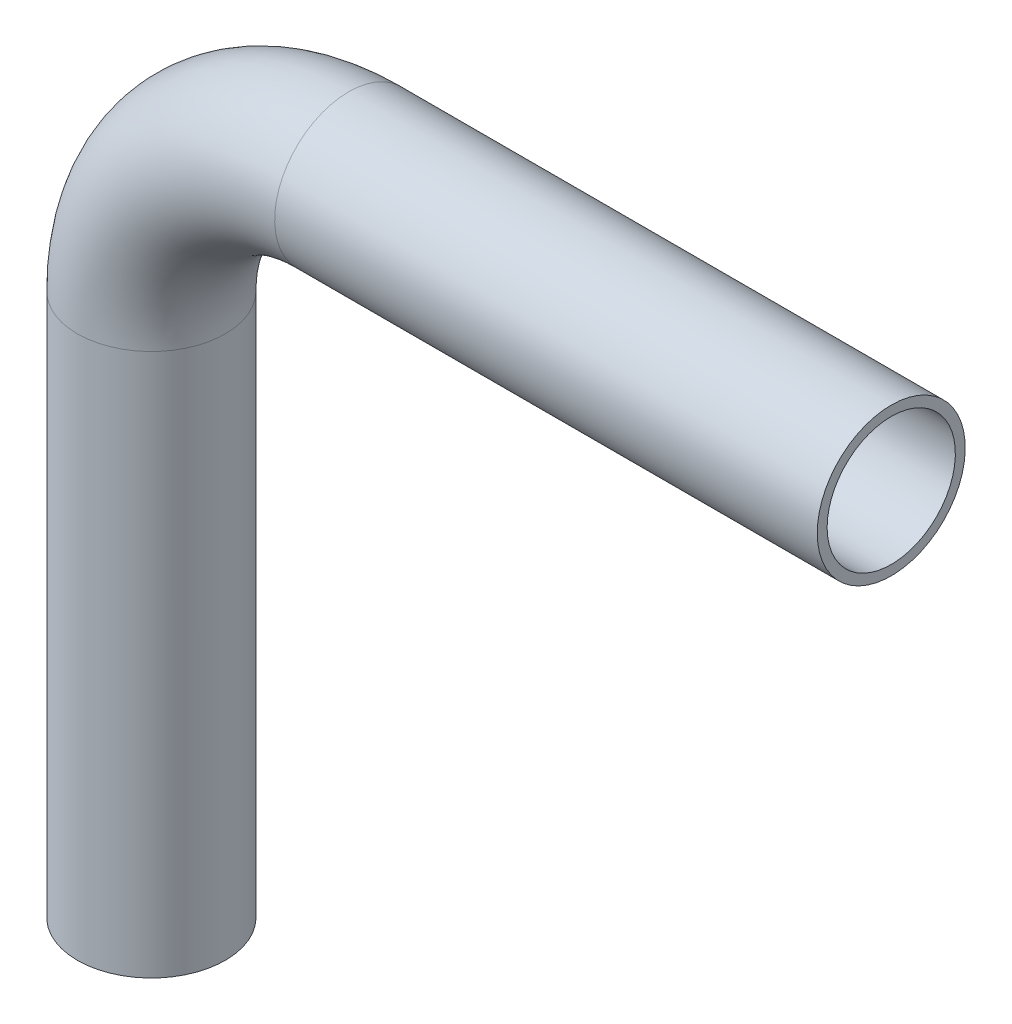
ISO-10303-21;
HEADER;
FILE_DESCRIPTION(('STEP AP214'),'2;1');
FILE_NAME('part.step','',(''),(''),'','','');
FILE_SCHEMA(('AUTOMOTIVE_DESIGN { 1 0 10303 214 1 1 1 1 }'));
ENDSEC;
DATA;
#1=APPLICATION_CONTEXT('core data for automotive mechanical design processes');
#2=APPLICATION_PROTOCOL_DEFINITION('international standard','automotive_design',2000,#1);
#3=PRODUCT_CONTEXT('',#1,'mechanical');
#4=PRODUCT('Part','Part','',(#3));
#5=PRODUCT_RELATED_PRODUCT_CATEGORY('part','',(#4));
#6=PRODUCT_DEFINITION_FORMATION('','',#4);
#7=PRODUCT_DEFINITION_CONTEXT('part definition',#1,'design');
#8=PRODUCT_DEFINITION('design','',#6,#7);
#9=PRODUCT_DEFINITION_SHAPE('','',#8);
#10=(LENGTH_UNIT() NAMED_UNIT(*) SI_UNIT(.MILLI.,.METRE.));
#11=(NAMED_UNIT(*) PLANE_ANGLE_UNIT() SI_UNIT($,.RADIAN.));
#12=(NAMED_UNIT(*) SI_UNIT($,.STERADIAN.) SOLID_ANGLE_UNIT());
#13=UNCERTAINTY_MEASURE_WITH_UNIT(LENGTH_MEASURE(1.E-05),#10,'distance_accuracy_value','');
#14=(GEOMETRIC_REPRESENTATION_CONTEXT(3) GLOBAL_UNCERTAINTY_ASSIGNED_CONTEXT((#13)) GLOBAL_UNIT_ASSIGNED_CONTEXT((#10,
#11,#12)) REPRESENTATION_CONTEXT('',''));
#15=CARTESIAN_POINT('',(0.,0.,0.));
#16=DIRECTION('',(0.,0.,1.));
#17=DIRECTION('',(1.,0.,0.));
#18=AXIS2_PLACEMENT_3D('',#15,#16,#17);
#19=CARTESIAN_POINT('',(0.,0.,0.));
#20=DIRECTION('',(0.,1.,0.));
#21=DIRECTION('',(0.,0.,1.));
#22=AXIS2_PLACEMENT_3D('',#19,#20,#21);
#23=CYLINDRICAL_SURFACE('',#22,15.);
#24=CARTESIAN_POINT('',(0.,110.,0.));
#25=DIRECTION('',(0.,1.,0.));
#26=DIRECTION('',(0.,0.,1.));
#27=AXIS2_PLACEMENT_3D('',#24,#25,#26);
#28=CIRCLE('',#27,15.);
#29=CARTESIAN_POINT('',(-15.,110.,0.));
#30=VERTEX_POINT('',#29);
#31=EDGE_CURVE('E70',#30,#30,#28,.T.);
#32=ORIENTED_EDGE('',*,*,#31,.F.);
#33=EDGE_LOOP('',(#32));
#34=FACE_BOUND('',#33,.T.);
#35=CARTESIAN_POINT('',(0.,0.,0.));
#36=DIRECTION('',(0.,1.,0.));
#37=DIRECTION('',(0.,0.,1.));
#38=AXIS2_PLACEMENT_3D('',#35,#36,#37);
#39=CIRCLE('',#38,15.);
#40=CARTESIAN_POINT('',(0.,0.,15.));
#41=VERTEX_POINT('',#40);
#42=EDGE_CURVE('E67',#41,#41,#39,.T.);
#43=ORIENTED_EDGE('',*,*,#42,.T.);
#44=EDGE_LOOP('',(#43));
#45=FACE_BOUND('',#44,.T.);
#46=ADVANCED_FACE('F43',(#34,#45),#23,.T.);
#47=CARTESIAN_POINT('',(40.,110.,0.));
#48=DIRECTION('',(0.,0.,-1.));
#49=DIRECTION('',(-1.,0.,0.));
#50=AXIS2_PLACEMENT_3D('',#47,#48,#49);
#51=TOROIDAL_SURFACE('',#50,40.,15.);
#52=CARTESIAN_POINT('',(40.0000000000003,150.,0.));
#53=DIRECTION('',(1.,0.,0.));
#54=DIRECTION('',(0.,0.,1.));
#55=AXIS2_PLACEMENT_3D('',#52,#53,#54);
#56=CIRCLE('',#55,15.);
#57=CARTESIAN_POINT('',(40.0000000000004,165.,0.));
#58=VERTEX_POINT('',#57);
#59=EDGE_CURVE('E47',#58,#58,#56,.T.);
#60=CARTESIAN_POINT('',(40.,110.,0.));
#61=DIRECTION('',(0.,0.,-1.));
#62=DIRECTION('',(-1.,0.,0.));
#63=AXIS2_PLACEMENT_3D('',#60,#61,#62);
#64=CIRCLE('',#63,55.);
#65=EDGE_CURVE('',#30,#58,#64,.T.);
#66=ORIENTED_EDGE('',*,*,#31,.T.);
#67=ORIENTED_EDGE('',*,*,#59,.F.);
#68=ORIENTED_EDGE('',*,*,#65,.T.);
#69=ORIENTED_EDGE('',*,*,#65,.F.);
#70=EDGE_LOOP('',(#66,#68,#67,#69));
#71=FACE_BOUND('',#70,.T.);
#72=ADVANCED_FACE('F80',(#71),#51,.T.);
#73=CARTESIAN_POINT('',(40.0000000000003,150.,0.));
#74=DIRECTION('',(1.,0.,0.));
#75=DIRECTION('',(0.,0.,-1.));
#76=AXIS2_PLACEMENT_3D('',#73,#74,#75);
#77=CYLINDRICAL_SURFACE('',#76,15.);
#78=CARTESIAN_POINT('',(150.,150.,0.));
#79=DIRECTION('',(1.,0.,0.));
#80=DIRECTION('',(0.,0.,1.));
#81=AXIS2_PLACEMENT_3D('',#78,#79,#80);
#82=CIRCLE('',#81,15.);
#83=CARTESIAN_POINT('',(150.,150.,15.));
#84=VERTEX_POINT('',#83);
#85=EDGE_CURVE('E62',#84,#84,#82,.T.);
#86=ORIENTED_EDGE('',*,*,#85,.F.);
#87=EDGE_LOOP('',(#86));
#88=FACE_BOUND('',#87,.T.);
#89=ORIENTED_EDGE('',*,*,#59,.T.);
#90=EDGE_LOOP('',(#89));
#91=FACE_BOUND('',#90,.T.);
#92=ADVANCED_FACE('F45',(#88,#91),#77,.T.);
#93=CARTESIAN_POINT('',(0.,0.,0.));
#94=DIRECTION('',(0.,1.,0.));
#95=DIRECTION('',(0.,0.,1.));
#96=AXIS2_PLACEMENT_3D('',#93,#94,#95);
#97=PLANE('',#96);
#98=CARTESIAN_POINT('',(0.,0.,0.));
#99=DIRECTION('',(0.,1.,0.));
#100=DIRECTION('',(0.,0.,1.));
#101=AXIS2_PLACEMENT_3D('',#98,#99,#100);
#102=CIRCLE('',#101,13.);
#103=CARTESIAN_POINT('',(0.,0.,13.));
#104=VERTEX_POINT('',#103);
#105=EDGE_CURVE('E66',#104,#104,#102,.F.);
#106=ORIENTED_EDGE('',*,*,#105,.F.);
#107=EDGE_LOOP('',(#106));
#108=FACE_BOUND('',#107,.T.);
#109=ORIENTED_EDGE('',*,*,#42,.F.);
#110=EDGE_LOOP('',(#109));
#111=FACE_BOUND('',#110,.T.);
#112=ADVANCED_FACE('F86',(#108,#111),#97,.F.);
#113=CARTESIAN_POINT('',(150.,150.,0.));
#114=DIRECTION('',(1.,0.,0.));
#115=DIRECTION('',(0.,0.,1.));
#116=AXIS2_PLACEMENT_3D('',#113,#114,#115);
#117=PLANE('',#116);
#118=CARTESIAN_POINT('',(150.,150.,0.));
#119=DIRECTION('',(1.,0.,0.));
#120=DIRECTION('',(0.,0.,1.));
#121=AXIS2_PLACEMENT_3D('',#118,#119,#120);
#122=CIRCLE('',#121,13.);
#123=CARTESIAN_POINT('',(150.,150.,13.));
#124=VERTEX_POINT('',#123);
#125=EDGE_CURVE('E10',#124,#124,#122,.F.);
#126=ORIENTED_EDGE('',*,*,#125,.T.);
#127=EDGE_LOOP('',(#126));
#128=FACE_BOUND('',#127,.T.);
#129=ORIENTED_EDGE('',*,*,#85,.T.);
#130=EDGE_LOOP('',(#129));
#131=FACE_BOUND('',#130,.T.);
#132=ADVANCED_FACE('F104',(#128,#131),#117,.T.);
#133=CARTESIAN_POINT('',(0.,0.,0.));
#134=DIRECTION('',(0.,1.,0.));
#135=DIRECTION('',(0.,0.,1.));
#136=AXIS2_PLACEMENT_3D('',#133,#134,#135);
#137=CYLINDRICAL_SURFACE('',#136,13.);
#138=CARTESIAN_POINT('',(0.,110.,0.));
#139=DIRECTION('',(0.,1.,0.));
#140=DIRECTION('',(0.,0.,1.));
#141=AXIS2_PLACEMENT_3D('',#138,#139,#140);
#142=CIRCLE('',#141,13.);
#143=CARTESIAN_POINT('',(-13.,110.,0.));
#144=VERTEX_POINT('',#143);
#145=EDGE_CURVE('E58',#144,#144,#142,.F.);
#146=ORIENTED_EDGE('',*,*,#145,.F.);
#147=EDGE_LOOP('',(#146));
#148=FACE_BOUND('',#147,.T.);
#149=ORIENTED_EDGE('',*,*,#105,.T.);
#150=EDGE_LOOP('',(#149));
#151=FACE_BOUND('',#150,.T.);
#152=ADVANCED_FACE('F98',(#148,#151),#137,.F.);
#153=CARTESIAN_POINT('',(40.,110.,0.));
#154=DIRECTION('',(0.,0.,-1.));
#155=DIRECTION('',(-1.,0.,0.));
#156=AXIS2_PLACEMENT_3D('',#153,#154,#155);
#157=TOROIDAL_SURFACE('',#156,40.,13.);
#158=CARTESIAN_POINT('',(40.0000000000003,150.,0.));
#159=DIRECTION('',(1.,0.,0.));
#160=DIRECTION('',(0.,0.,1.));
#161=AXIS2_PLACEMENT_3D('',#158,#159,#160);
#162=CIRCLE('',#161,13.);
#163=CARTESIAN_POINT('',(40.0000000000004,163.,0.));
#164=VERTEX_POINT('',#163);
#165=EDGE_CURVE('E52',#164,#164,#162,.F.);
#166=CARTESIAN_POINT('',(40.,110.,0.));
#167=DIRECTION('',(0.,0.,-1.));
#168=DIRECTION('',(-1.,0.,0.));
#169=AXIS2_PLACEMENT_3D('',#166,#167,#168);
#170=CIRCLE('',#169,53.);
#171=EDGE_CURVE('',#144,#164,#170,.T.);
#172=ORIENTED_EDGE('',*,*,#145,.T.);
#173=ORIENTED_EDGE('',*,*,#165,.F.);
#174=ORIENTED_EDGE('',*,*,#171,.T.);
#175=ORIENTED_EDGE('',*,*,#171,.F.);
#176=EDGE_LOOP('',(#172,#174,#173,#175));
#177=FACE_BOUND('',#176,.T.);
#178=ADVANCED_FACE('F92',(#177),#157,.F.);
#179=CARTESIAN_POINT('',(40.0000000000003,150.,0.));
#180=DIRECTION('',(1.,0.,0.));
#181=DIRECTION('',(0.,0.,-1.));
#182=AXIS2_PLACEMENT_3D('',#179,#180,#181);
#183=CYLINDRICAL_SURFACE('',#182,13.);
#184=ORIENTED_EDGE('',*,*,#125,.F.);
#185=EDGE_LOOP('',(#184));
#186=FACE_BOUND('',#185,.T.);
#187=ORIENTED_EDGE('',*,*,#165,.T.);
#188=EDGE_LOOP('',(#187));
#189=FACE_BOUND('',#188,.T.);
#190=ADVANCED_FACE('F90',(#186,#189),#183,.F.);
#191=CLOSED_SHELL('',(#46,#72,#92,#112,#132,#152,#178,#190));
#192=MANIFOLD_SOLID_BREP('B2',#191);
#193=ADVANCED_BREP_SHAPE_REPRESENTATION('',(#18,#192),#14);
#194=SHAPE_DEFINITION_REPRESENTATION(#9,#193);
ENDSEC;
END-ISO-10303-21;
